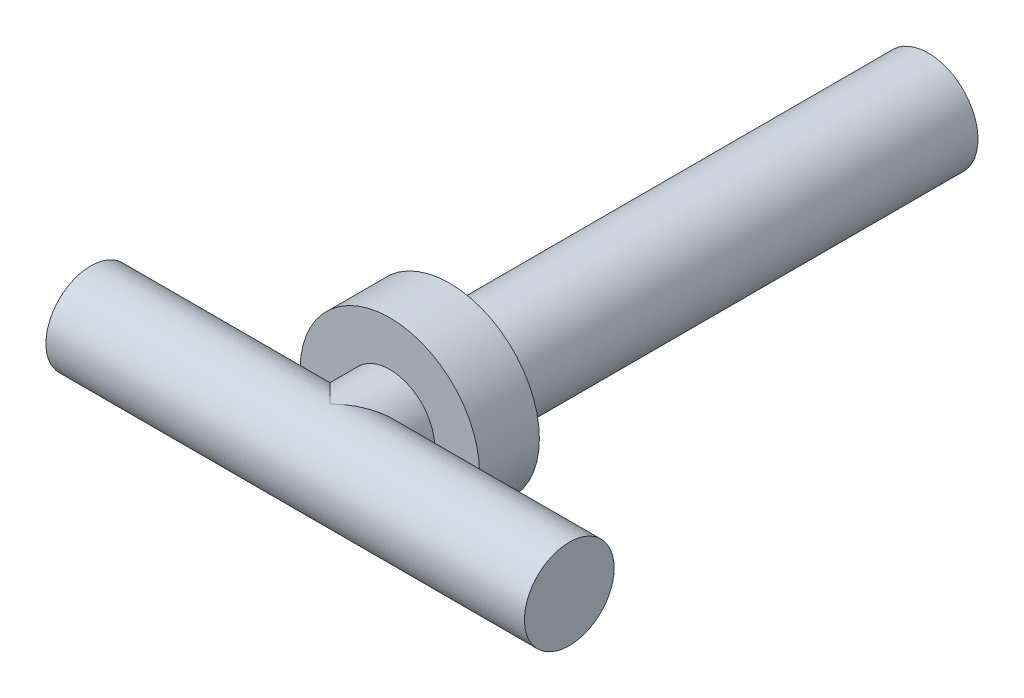
ISO-10303-21;
HEADER;
FILE_DESCRIPTION(('STEP AP214'),'2;1');
FILE_NAME('part.step','',(''),(''),'','','');
FILE_SCHEMA(('AUTOMOTIVE_DESIGN { 1 0 10303 214 1 1 1 1 }'));
ENDSEC;
DATA;
#1=APPLICATION_CONTEXT('core data for automotive mechanical design processes');
#2=APPLICATION_PROTOCOL_DEFINITION('international standard','automotive_design',2000,#1);
#3=PRODUCT_CONTEXT('',#1,'mechanical');
#4=PRODUCT('Part','Part','',(#3));
#5=PRODUCT_RELATED_PRODUCT_CATEGORY('part','',(#4));
#6=PRODUCT_DEFINITION_FORMATION('','',#4);
#7=PRODUCT_DEFINITION_CONTEXT('part definition',#1,'design');
#8=PRODUCT_DEFINITION('design','',#6,#7);
#9=PRODUCT_DEFINITION_SHAPE('','',#8);
#10=(LENGTH_UNIT() NAMED_UNIT(*) SI_UNIT(.MILLI.,.METRE.));
#11=(NAMED_UNIT(*) PLANE_ANGLE_UNIT() SI_UNIT($,.RADIAN.));
#12=(NAMED_UNIT(*) SI_UNIT($,.STERADIAN.) SOLID_ANGLE_UNIT());
#13=UNCERTAINTY_MEASURE_WITH_UNIT(LENGTH_MEASURE(1.E-05),#10,'distance_accuracy_value','');
#14=(GEOMETRIC_REPRESENTATION_CONTEXT(3) GLOBAL_UNCERTAINTY_ASSIGNED_CONTEXT((#13)) GLOBAL_UNIT_ASSIGNED_CONTEXT((#10,
#11,#12)) REPRESENTATION_CONTEXT('',''));
#15=CARTESIAN_POINT('',(0.,0.,0.));
#16=DIRECTION('',(0.,0.,1.));
#17=DIRECTION('',(1.,0.,0.));
#18=AXIS2_PLACEMENT_3D('',#15,#16,#17);
#19=CARTESIAN_POINT('',(24.,0.,38.));
#20=DIRECTION('',(-1.,0.,0.));
#21=DIRECTION('',(0.,0.,1.));
#22=AXIS2_PLACEMENT_3D('',#19,#20,#21);
#23=CYLINDRICAL_SURFACE('',#22,4.5);
#24=CARTESIAN_POINT('',(-24.,0.,38.));
#25=DIRECTION('',(1.,0.,0.));
#26=DIRECTION('',(0.,0.,-1.));
#27=AXIS2_PLACEMENT_3D('',#24,#25,#26);
#28=CIRCLE('',#27,4.5);
#29=CARTESIAN_POINT('',(-24.,0.,33.5));
#30=VERTEX_POINT('',#29);
#31=EDGE_CURVE('E59',#30,#30,#28,.T.);
#32=ORIENTED_EDGE('',*,*,#31,.T.);
#33=EDGE_LOOP('',(#32));
#34=FACE_BOUND('',#33,.T.);
#35=CARTESIAN_POINT('',(24.,0.,38.));
#36=DIRECTION('',(1.,0.,0.));
#37=DIRECTION('',(0.,0.,-1.));
#38=AXIS2_PLACEMENT_3D('',#35,#36,#37);
#39=CIRCLE('',#38,4.5);
#40=CARTESIAN_POINT('',(24.,0.,33.5));
#41=VERTEX_POINT('',#40);
#42=EDGE_CURVE('E57',#41,#41,#39,.T.);
#43=ORIENTED_EDGE('',*,*,#42,.F.);
#44=EDGE_LOOP('',(#43));
#45=FACE_BOUND('',#44,.T.);
#46=CARTESIAN_POINT('',(0.,0.,38.));
#47=DIRECTION('',(-0.707106781186547,0.,-0.707106781186547));
#48=DIRECTION('',(-0.707106781186548,0.,0.707106781186547));
#49=AXIS2_PLACEMENT_3D('',#46,#47,#48);
#50=ELLIPSE('',#49,6.36396103067893,4.5);
#51=CARTESIAN_POINT('',(0.,4.5,38.));
#52=VERTEX_POINT('',#51);
#53=CARTESIAN_POINT('',(0.,-4.5,38.));
#54=VERTEX_POINT('',#53);
#55=EDGE_CURVE('E11',#52,#54,#50,.T.);
#56=ORIENTED_EDGE('',*,*,#55,.F.);
#57=CARTESIAN_POINT('',(0.,0.,38.));
#58=DIRECTION('',(-0.707106781186548,0.,0.707106781186547));
#59=DIRECTION('',(-0.707106781186547,0.,-0.707106781186547));
#60=AXIS2_PLACEMENT_3D('',#57,#58,#59);
#61=ELLIPSE('',#60,6.36396103067893,4.5);
#62=EDGE_CURVE('E48',#54,#52,#61,.F.);
#63=ORIENTED_EDGE('',*,*,#62,.F.);
#64=EDGE_LOOP('',(#56,#63));
#65=FACE_BOUND('',#64,.T.);
#66=ADVANCED_FACE('F41',(#34,#45,#65),#23,.T.);
#67=CARTESIAN_POINT('',(24.,0.,38.));
#68=DIRECTION('',(1.,0.,0.));
#69=DIRECTION('',(0.,0.,-1.));
#70=AXIS2_PLACEMENT_3D('',#67,#68,#69);
#71=PLANE('',#70);
#72=ORIENTED_EDGE('',*,*,#42,.T.);
#73=EDGE_LOOP('',(#72));
#74=FACE_BOUND('',#73,.T.);
#75=ADVANCED_FACE('F94',(#74),#71,.T.);
#76=CARTESIAN_POINT('',(-24.,0.,38.));
#77=DIRECTION('',(1.,0.,0.));
#78=DIRECTION('',(0.,0.,-1.));
#79=AXIS2_PLACEMENT_3D('',#76,#77,#78);
#80=PLANE('',#79);
#81=ORIENTED_EDGE('',*,*,#31,.F.);
#82=EDGE_LOOP('',(#81));
#83=FACE_BOUND('',#82,.T.);
#84=ADVANCED_FACE('F97',(#83),#80,.F.);
#85=CARTESIAN_POINT('',(0.,0.,38.));
#86=DIRECTION('',(0.,0.,-1.));
#87=DIRECTION('',(-1.,0.,0.));
#88=AXIS2_PLACEMENT_3D('',#85,#86,#87);
#89=CYLINDRICAL_SURFACE('',#88,4.5);
#90=CARTESIAN_POINT('',(0.,0.,32.));
#91=DIRECTION('',(0.,0.,1.));
#92=DIRECTION('',(1.,0.,0.));
#93=AXIS2_PLACEMENT_3D('',#90,#91,#92);
#94=CIRCLE('',#93,4.5);
#95=CARTESIAN_POINT('',(4.5,0.,32.));
#96=VERTEX_POINT('',#95);
#97=EDGE_CURVE('E63',#96,#96,#94,.F.);
#98=ORIENTED_EDGE('',*,*,#97,.F.);
#99=EDGE_LOOP('',(#98));
#100=FACE_BOUND('',#99,.T.);
#101=ORIENTED_EDGE('',*,*,#62,.T.);
#102=ORIENTED_EDGE('',*,*,#55,.T.);
#103=EDGE_LOOP('',(#101,#102));
#104=FACE_BOUND('',#103,.T.);
#105=ADVANCED_FACE('F54',(#100,#104),#89,.T.);
#106=CARTESIAN_POINT('',(0.,0.,32.));
#107=DIRECTION('',(0.,0.,-1.));
#108=DIRECTION('',(-1.,0.,0.));
#109=AXIS2_PLACEMENT_3D('',#106,#107,#108);
#110=CYLINDRICAL_SURFACE('',#109,9.);
#111=CARTESIAN_POINT('',(0.,0.,32.));
#112=DIRECTION('',(0.,0.,1.));
#113=DIRECTION('',(1.,0.,0.));
#114=AXIS2_PLACEMENT_3D('',#111,#112,#113);
#115=CIRCLE('',#114,9.);
#116=CARTESIAN_POINT('',(9.,0.,32.));
#117=VERTEX_POINT('',#116);
#118=EDGE_CURVE('E72',#117,#117,#115,.T.);
#119=ORIENTED_EDGE('',*,*,#118,.F.);
#120=EDGE_LOOP('',(#119));
#121=FACE_BOUND('',#120,.T.);
#122=CARTESIAN_POINT('',(0.,0.,26.));
#123=DIRECTION('',(0.,0.,1.));
#124=DIRECTION('',(1.,0.,0.));
#125=AXIS2_PLACEMENT_3D('',#122,#123,#124);
#126=CIRCLE('',#125,9.);
#127=CARTESIAN_POINT('',(9.,0.,26.));
#128=VERTEX_POINT('',#127);
#129=EDGE_CURVE('E70',#128,#128,#126,.T.);
#130=ORIENTED_EDGE('',*,*,#129,.T.);
#131=EDGE_LOOP('',(#130));
#132=FACE_BOUND('',#131,.T.);
#133=ADVANCED_FACE('F108',(#121,#132),#110,.T.);
#134=CARTESIAN_POINT('',(0.,0.,32.));
#135=DIRECTION('',(0.,0.,1.));
#136=DIRECTION('',(1.,0.,0.));
#137=AXIS2_PLACEMENT_3D('',#134,#135,#136);
#138=PLANE('',#137);
#139=ORIENTED_EDGE('',*,*,#97,.T.);
#140=EDGE_LOOP('',(#139));
#141=FACE_BOUND('',#140,.T.);
#142=ORIENTED_EDGE('',*,*,#118,.T.);
#143=EDGE_LOOP('',(#142));
#144=FACE_BOUND('',#143,.T.);
#145=ADVANCED_FACE('F89',(#141,#144),#138,.T.);
#146=CARTESIAN_POINT('',(0.,0.,26.));
#147=DIRECTION('',(0.,0.,1.));
#148=DIRECTION('',(1.,0.,0.));
#149=AXIS2_PLACEMENT_3D('',#146,#147,#148);
#150=PLANE('',#149);
#151=CARTESIAN_POINT('',(0.,0.,26.));
#152=DIRECTION('',(0.,0.,1.));
#153=DIRECTION('',(1.,0.,0.));
#154=AXIS2_PLACEMENT_3D('',#151,#152,#153);
#155=CIRCLE('',#154,5.);
#156=CARTESIAN_POINT('',(5.,0.,26.));
#157=VERTEX_POINT('',#156);
#158=EDGE_CURVE('E65',#157,#157,#155,.F.);
#159=ORIENTED_EDGE('',*,*,#158,.F.);
#160=EDGE_LOOP('',(#159));
#161=FACE_BOUND('',#160,.T.);
#162=ORIENTED_EDGE('',*,*,#129,.F.);
#163=EDGE_LOOP('',(#162));
#164=FACE_BOUND('',#163,.T.);
#165=ADVANCED_FACE('F81',(#161,#164),#150,.F.);
#166=CARTESIAN_POINT('',(0.,0.,-22.));
#167=DIRECTION('',(0.,0.,1.));
#168=DIRECTION('',(1.,0.,0.));
#169=AXIS2_PLACEMENT_3D('',#166,#167,#168);
#170=PLANE('',#169);
#171=CARTESIAN_POINT('',(0.,0.,-22.));
#172=DIRECTION('',(0.,0.,1.));
#173=DIRECTION('',(1.,0.,0.));
#174=AXIS2_PLACEMENT_3D('',#171,#172,#173);
#175=CIRCLE('',#174,5.);
#176=CARTESIAN_POINT('',(5.,0.,-22.));
#177=VERTEX_POINT('',#176);
#178=EDGE_CURVE('E69',#177,#177,#175,.T.);
#179=ORIENTED_EDGE('',*,*,#178,.F.);
#180=EDGE_LOOP('',(#179));
#181=FACE_BOUND('',#180,.T.);
#182=ADVANCED_FACE('F85',(#181),#170,.F.);
#183=CARTESIAN_POINT('',(0.,0.,30.));
#184=DIRECTION('',(0.,0.,-1.));
#185=DIRECTION('',(-1.,0.,0.));
#186=AXIS2_PLACEMENT_3D('',#183,#184,#185);
#187=CYLINDRICAL_SURFACE('',#186,5.);
#188=ORIENTED_EDGE('',*,*,#178,.T.);
#189=EDGE_LOOP('',(#188));
#190=FACE_BOUND('',#189,.T.);
#191=ORIENTED_EDGE('',*,*,#158,.T.);
#192=EDGE_LOOP('',(#191));
#193=FACE_BOUND('',#192,.T.);
#194=ADVANCED_FACE('F78',(#190,#193),#187,.T.);
#195=CLOSED_SHELL('',(#66,#75,#84,#105,#133,#145,#165,#182,#194));
#196=MANIFOLD_SOLID_BREP('B2',#195);
#197=ADVANCED_BREP_SHAPE_REPRESENTATION('',(#18,#196),#14);
#198=SHAPE_DEFINITION_REPRESENTATION(#9,#197);
ENDSEC;
END-ISO-10303-21;
